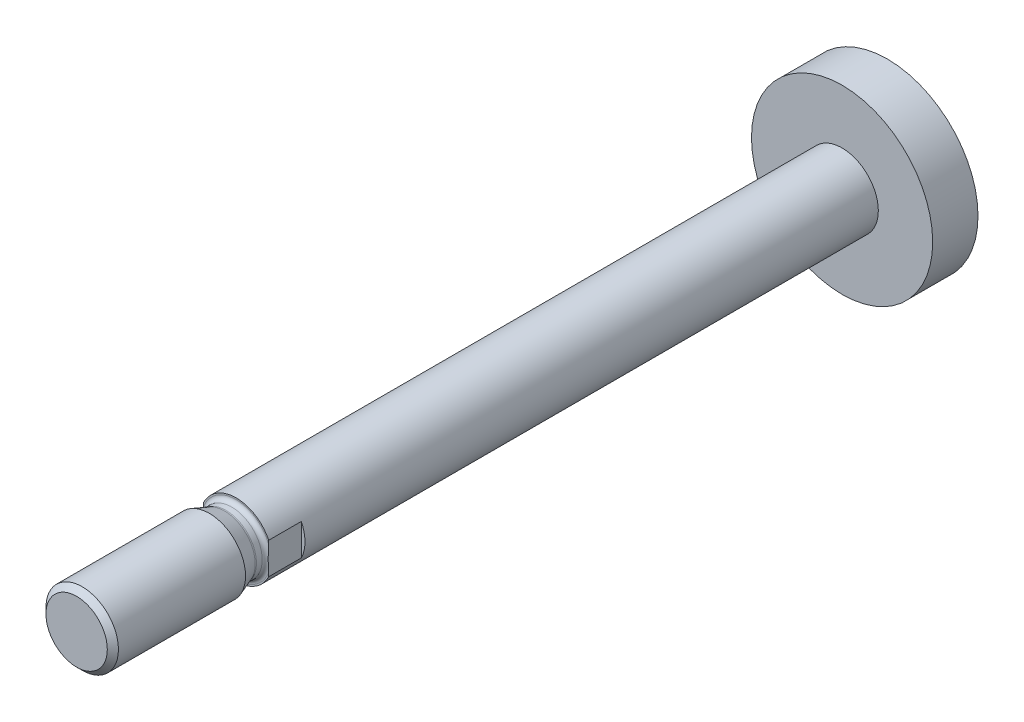
ISO-10303-21;
HEADER;
FILE_DESCRIPTION(('STEP AP214'),'2;1');
FILE_NAME('part.step','',(''),(''),'','','');
FILE_SCHEMA(('AUTOMOTIVE_DESIGN { 1 0 10303 214 1 1 1 1 }'));
ENDSEC;
DATA;
#1=APPLICATION_CONTEXT('core data for automotive mechanical design processes');
#2=APPLICATION_PROTOCOL_DEFINITION('international standard','automotive_design',2000,#1);
#3=PRODUCT_CONTEXT('',#1,'mechanical');
#4=PRODUCT('Part','Part','',(#3));
#5=PRODUCT_RELATED_PRODUCT_CATEGORY('part','',(#4));
#6=PRODUCT_DEFINITION_FORMATION('','',#4);
#7=PRODUCT_DEFINITION_CONTEXT('part definition',#1,'design');
#8=PRODUCT_DEFINITION('design','',#6,#7);
#9=PRODUCT_DEFINITION_SHAPE('','',#8);
#10=(LENGTH_UNIT() NAMED_UNIT(*) SI_UNIT(.MILLI.,.METRE.));
#11=(NAMED_UNIT(*) PLANE_ANGLE_UNIT() SI_UNIT($,.RADIAN.));
#12=(NAMED_UNIT(*) SI_UNIT($,.STERADIAN.) SOLID_ANGLE_UNIT());
#13=UNCERTAINTY_MEASURE_WITH_UNIT(LENGTH_MEASURE(1.E-05),#10,'distance_accuracy_value','');
#14=(GEOMETRIC_REPRESENTATION_CONTEXT(3) GLOBAL_UNCERTAINTY_ASSIGNED_CONTEXT((#13)) GLOBAL_UNIT_ASSIGNED_CONTEXT((#10,
#11,#12)) REPRESENTATION_CONTEXT('',''));
#15=CARTESIAN_POINT('',(0.,0.,0.));
#16=DIRECTION('',(0.,0.,1.));
#17=DIRECTION('',(1.,0.,0.));
#18=AXIS2_PLACEMENT_3D('',#15,#16,#17);
#19=CARTESIAN_POINT('',(0.,0.,1.5));
#20=DIRECTION('',(0.,0.,1.));
#21=DIRECTION('',(-1.,0.,0.));
#22=AXIS2_PLACEMENT_3D('',#19,#20,#21);
#23=PLANE('',#22);
#24=CARTESIAN_POINT('',(0.,0.,1.5));
#25=DIRECTION('',(0.,0.,1.));
#26=DIRECTION('',(-1.,0.,0.));
#27=AXIS2_PLACEMENT_3D('',#24,#25,#26);
#28=CIRCLE('',#27,5.);
#29=CARTESIAN_POINT('',(-4.5,2.17944947177034,1.5));
#30=VERTEX_POINT('',#29);
#31=CARTESIAN_POINT('',(-4.5,-2.17944947177034,1.5));
#32=VERTEX_POINT('',#31);
#33=EDGE_CURVE('E11',#30,#32,#28,.T.);
#34=ORIENTED_EDGE('',*,*,#33,.T.);
#35=DIRECTION('',(0.,1.,0.));
#36=VECTOR('',#35,1.);
#37=CARTESIAN_POINT('',(-4.5,-9.,1.5));
#38=LINE('',#37,#36);
#39=EDGE_CURVE('E143',#32,#30,#38,.T.);
#40=ORIENTED_EDGE('',*,*,#39,.T.);
#41=EDGE_LOOP('',(#34,#40));
#42=FACE_BOUND('',#41,.T.);
#43=ADVANCED_FACE('F16',(#42),#23,.T.);
#44=CARTESIAN_POINT('',(0.,0.,-83.85));
#45=DIRECTION('',(0.,0.,1.));
#46=DIRECTION('',(1.,0.,0.));
#47=AXIS2_PLACEMENT_3D('',#44,#45,#46);
#48=CYLINDRICAL_SURFACE('',#47,5.);
#49=CARTESIAN_POINT('',(0.,0.,-77.6));
#50=DIRECTION('',(0.,0.,-1.));
#51=DIRECTION('',(1.,0.,0.));
#52=AXIS2_PLACEMENT_3D('',#49,#50,#51);
#53=CIRCLE('',#52,5.);
#54=CARTESIAN_POINT('',(5.,0.,-77.6));
#55=VERTEX_POINT('',#54);
#56=EDGE_CURVE('E28',#55,#55,#53,.T.);
#57=ORIENTED_EDGE('',*,*,#56,.F.);
#58=EDGE_LOOP('',(#57));
#59=FACE_BOUND('',#58,.T.);
#60=DIRECTION('',(0.,0.,-1.));
#61=VECTOR('',#60,1.);
#62=CARTESIAN_POINT('',(4.5,-2.17944947177034,-83.85));
#63=LINE('',#62,#61);
#64=CARTESIAN_POINT('',(4.5,-2.17944947177034,6.));
#65=VERTEX_POINT('',#64);
#66=CARTESIAN_POINT('',(4.5,-2.17944947177034,1.5));
#67=VERTEX_POINT('',#66);
#68=EDGE_CURVE('E229',#65,#67,#63,.T.);
#69=ORIENTED_EDGE('',*,*,#68,.F.);
#70=CARTESIAN_POINT('',(0.,0.,6.));
#71=DIRECTION('',(0.,0.,-1.));
#72=DIRECTION('',(1.,0.,0.));
#73=AXIS2_PLACEMENT_3D('',#70,#71,#72);
#74=CIRCLE('',#73,5.);
#75=CARTESIAN_POINT('',(-4.5,-2.17944947177034,6.));
#76=VERTEX_POINT('',#75);
#77=EDGE_CURVE('E264',#65,#76,#74,.T.);
#78=ORIENTED_EDGE('',*,*,#77,.T.);
#79=DIRECTION('',(0.,0.,1.));
#80=VECTOR('',#79,1.);
#81=CARTESIAN_POINT('',(-4.5,-2.17944947177034,-83.85));
#82=LINE('',#81,#80);
#83=EDGE_CURVE('E224',#32,#76,#82,.T.);
#84=ORIENTED_EDGE('',*,*,#83,.F.);
#85=ORIENTED_EDGE('',*,*,#33,.F.);
#86=DIRECTION('',(0.,0.,-1.));
#87=VECTOR('',#86,1.);
#88=CARTESIAN_POINT('',(-4.5,2.17944947177034,-83.85));
#89=LINE('',#88,#87);
#90=CARTESIAN_POINT('',(-4.5,2.17944947177034,6.));
#91=VERTEX_POINT('',#90);
#92=EDGE_CURVE('E139',#91,#30,#89,.T.);
#93=ORIENTED_EDGE('',*,*,#92,.F.);
#94=CARTESIAN_POINT('',(0.,0.,6.));
#95=DIRECTION('',(0.,0.,-1.));
#96=DIRECTION('',(1.,0.,0.));
#97=AXIS2_PLACEMENT_3D('',#94,#95,#96);
#98=CIRCLE('',#97,5.);
#99=CARTESIAN_POINT('',(4.5,2.17944947177034,6.));
#100=VERTEX_POINT('',#99);
#101=EDGE_CURVE('E274',#91,#100,#98,.T.);
#102=ORIENTED_EDGE('',*,*,#101,.T.);
#103=DIRECTION('',(0.,0.,1.));
#104=VECTOR('',#103,1.);
#105=CARTESIAN_POINT('',(4.5,2.17944947177034,-83.85));
#106=LINE('',#105,#104);
#107=CARTESIAN_POINT('',(4.5,2.17944947177034,1.5));
#108=VERTEX_POINT('',#107);
#109=EDGE_CURVE('E270',#108,#100,#106,.T.);
#110=ORIENTED_EDGE('',*,*,#109,.F.);
#111=CARTESIAN_POINT('',(0.,0.,1.5));
#112=DIRECTION('',(0.,0.,1.));
#113=DIRECTION('',(-1.,0.,0.));
#114=AXIS2_PLACEMENT_3D('',#111,#112,#113);
#115=CIRCLE('',#114,5.);
#116=EDGE_CURVE('E257',#67,#108,#115,.T.);
#117=ORIENTED_EDGE('',*,*,#116,.F.);
#118=EDGE_LOOP('',(#69,#78,#84,#85,#93,#102,#110,#117));
#119=FACE_BOUND('',#118,.T.);
#120=ADVANCED_FACE('F178',(#59,#119),#48,.T.);
#121=CARTESIAN_POINT('',(0.,-5.,-77.6));
#122=DIRECTION('',(0.,0.,-1.));
#123=DIRECTION('',(0.,1.,0.));
#124=AXIS2_PLACEMENT_3D('',#121,#122,#123);
#125=PLANE('',#124);
#126=ORIENTED_EDGE('',*,*,#56,.T.);
#127=EDGE_LOOP('',(#126));
#128=FACE_BOUND('',#127,.T.);
#129=CARTESIAN_POINT('',(0.,0.,-77.6));
#130=DIRECTION('',(0.,0.,-1.));
#131=DIRECTION('',(1.,0.,0.));
#132=AXIS2_PLACEMENT_3D('',#129,#130,#131);
#133=CIRCLE('',#132,12.5);
#134=CARTESIAN_POINT('',(12.5,0.,-77.6));
#135=VERTEX_POINT('',#134);
#136=EDGE_CURVE('E132',#135,#135,#133,.T.);
#137=ORIENTED_EDGE('',*,*,#136,.F.);
#138=EDGE_LOOP('',(#137));
#139=FACE_BOUND('',#138,.T.);
#140=ADVANCED_FACE('F175',(#128,#139),#125,.F.);
#141=CARTESIAN_POINT('',(0.,0.,-83.85));
#142=DIRECTION('',(0.,0.,1.));
#143=DIRECTION('',(1.,0.,0.));
#144=AXIS2_PLACEMENT_3D('',#141,#142,#143);
#145=CYLINDRICAL_SURFACE('',#144,12.5);
#146=CARTESIAN_POINT('',(0.,0.,-83.85));
#147=DIRECTION('',(0.,0.,-1.));
#148=DIRECTION('',(1.,0.,0.));
#149=AXIS2_PLACEMENT_3D('',#146,#147,#148);
#150=CIRCLE('',#149,12.5);
#151=CARTESIAN_POINT('',(12.5,0.,-83.85));
#152=VERTEX_POINT('',#151);
#153=EDGE_CURVE('E126',#152,#152,#150,.T.);
#154=ORIENTED_EDGE('',*,*,#153,.F.);
#155=EDGE_LOOP('',(#154));
#156=FACE_BOUND('',#155,.T.);
#157=ORIENTED_EDGE('',*,*,#136,.T.);
#158=EDGE_LOOP('',(#157));
#159=FACE_BOUND('',#158,.T.);
#160=ADVANCED_FACE('F173',(#156,#159),#145,.T.);
#161=CARTESIAN_POINT('',(0.,-12.5,-83.85));
#162=DIRECTION('',(0.,0.,1.));
#163=DIRECTION('',(-1.,0.,0.));
#164=AXIS2_PLACEMENT_3D('',#161,#162,#163);
#165=PLANE('',#164);
#166=ORIENTED_EDGE('',*,*,#153,.T.);
#167=EDGE_LOOP('',(#166));
#168=FACE_BOUND('',#167,.T.);
#169=ADVANCED_FACE('F169',(#168),#165,.F.);
#170=CARTESIAN_POINT('',(0.,0.,28.));
#171=DIRECTION('',(0.,0.,-1.));
#172=DIRECTION('',(0.,1.,0.));
#173=AXIS2_PLACEMENT_3D('',#170,#171,#172);
#174=PLANE('',#173);
#175=CARTESIAN_POINT('',(0.,0.,28.));
#176=DIRECTION('',(0.,0.,-1.));
#177=DIRECTION('',(1.,0.,0.));
#178=AXIS2_PLACEMENT_3D('',#175,#176,#177);
#179=CIRCLE('',#178,4.233);
#180=CARTESIAN_POINT('',(4.233,0.,28.));
#181=VERTEX_POINT('',#180);
#182=EDGE_CURVE('E121',#181,#181,#179,.T.);
#183=ORIENTED_EDGE('',*,*,#182,.F.);
#184=EDGE_LOOP('',(#183));
#185=FACE_BOUND('',#184,.T.);
#186=ADVANCED_FACE('F172',(#185),#174,.F.);
#187=CARTESIAN_POINT('',(0.,0.,28.));
#188=DIRECTION('',(0.,0.,-1.));
#189=DIRECTION('',(1.,0.,0.));
#190=AXIS2_PLACEMENT_3D('',#187,#188,#189);
#191=CONICAL_SURFACE('',#190,4.233,0.785398163397448);
#192=ORIENTED_EDGE('',*,*,#182,.T.);
#193=EDGE_LOOP('',(#192));
#194=FACE_BOUND('',#193,.T.);
#195=CARTESIAN_POINT('',(0.,0.,27.233));
#196=DIRECTION('',(0.,0.,-1.));
#197=DIRECTION('',(1.,0.,0.));
#198=AXIS2_PLACEMENT_3D('',#195,#196,#197);
#199=CIRCLE('',#198,5.);
#200=CARTESIAN_POINT('',(5.,0.,27.233));
#201=VERTEX_POINT('',#200);
#202=EDGE_CURVE('E127',#201,#201,#199,.T.);
#203=ORIENTED_EDGE('',*,*,#202,.F.);
#204=EDGE_LOOP('',(#203));
#205=FACE_BOUND('',#204,.T.);
#206=ADVANCED_FACE('F122',(#194,#205),#191,.T.);
#207=CARTESIAN_POINT('',(0.,0.,5.));
#208=DIRECTION('',(0.,0.,1.));
#209=DIRECTION('',(1.,0.,0.));
#210=AXIS2_PLACEMENT_3D('',#207,#208,#209);
#211=CYLINDRICAL_SURFACE('',#210,5.);
#212=CARTESIAN_POINT('',(0.,0.,9.69798193556369));
#213=DIRECTION('',(0.,0.,-1.));
#214=DIRECTION('',(1.,0.,0.));
#215=AXIS2_PLACEMENT_3D('',#212,#213,#214);
#216=CIRCLE('',#215,5.);
#217=CARTESIAN_POINT('',(5.,0.,9.69798193556369));
#218=VERTEX_POINT('',#217);
#219=EDGE_CURVE('E114',#218,#218,#216,.T.);
#220=ORIENTED_EDGE('',*,*,#219,.F.);
#221=EDGE_LOOP('',(#220));
#222=FACE_BOUND('',#221,.T.);
#223=ORIENTED_EDGE('',*,*,#202,.T.);
#224=EDGE_LOOP('',(#223));
#225=FACE_BOUND('',#224,.T.);
#226=ADVANCED_FACE('F188',(#222,#225),#211,.T.);
#227=CARTESIAN_POINT('',(0.,0.,9.69798193556369));
#228=DIRECTION('',(0.,0.,1.));
#229=DIRECTION('',(-1.,0.,0.));
#230=AXIS2_PLACEMENT_3D('',#227,#228,#229);
#231=CONICAL_SURFACE('',#230,5.,0.349065850398867);
#232=CARTESIAN_POINT('',(0.,0.,7.59941589757032));
#233=DIRECTION('',(0.,0.,-1.));
#234=DIRECTION('',(1.,0.,0.));
#235=AXIS2_PLACEMENT_3D('',#232,#233,#234);
#236=CIRCLE('',#235,4.23618442752846);
#237=CARTESIAN_POINT('',(4.23618442752846,0.,7.59941589757032));
#238=VERTEX_POINT('',#237);
#239=EDGE_CURVE('E105',#238,#238,#236,.T.);
#240=ORIENTED_EDGE('',*,*,#239,.F.);
#241=EDGE_LOOP('',(#240));
#242=FACE_BOUND('',#241,.T.);
#243=ORIENTED_EDGE('',*,*,#219,.T.);
#244=EDGE_LOOP('',(#243));
#245=FACE_BOUND('',#244,.T.);
#246=ADVANCED_FACE('F185',(#242,#245),#231,.T.);
#247=CARTESIAN_POINT('',(0.,0.,7.39420381157492));
#248=DIRECTION('',(0.,0.,-1.));
#249=DIRECTION('',(1.,0.,0.));
#250=AXIS2_PLACEMENT_3D('',#247,#248,#249);
#251=TOROIDAL_SURFACE('',#250,4.8,0.6);
#252=CARTESIAN_POINT('',(0.,0.,7.39420381157492));
#253=DIRECTION('',(0.,0.,-1.));
#254=DIRECTION('',(1.,0.,0.));
#255=AXIS2_PLACEMENT_3D('',#252,#253,#254);
#256=CIRCLE('',#255,4.2);
#257=CARTESIAN_POINT('',(4.2,0.,7.39420381157492));
#258=VERTEX_POINT('',#257);
#259=EDGE_CURVE('E295',#258,#258,#256,.T.);
#260=ORIENTED_EDGE('',*,*,#259,.F.);
#261=EDGE_LOOP('',(#260));
#262=FACE_BOUND('',#261,.T.);
#263=ORIENTED_EDGE('',*,*,#239,.T.);
#264=EDGE_LOOP('',(#263));
#265=FACE_BOUND('',#264,.T.);
#266=ADVANCED_FACE('F167',(#262,#265),#251,.F.);
#267=CARTESIAN_POINT('',(0.,0.,5.));
#268=DIRECTION('',(0.,0.,1.));
#269=DIRECTION('',(1.,0.,0.));
#270=AXIS2_PLACEMENT_3D('',#267,#268,#269);
#271=CYLINDRICAL_SURFACE('',#270,4.2);
#272=CARTESIAN_POINT('',(0.,0.,6.6));
#273=DIRECTION('',(0.,0.,-1.));
#274=DIRECTION('',(1.,0.,0.));
#275=AXIS2_PLACEMENT_3D('',#272,#273,#274);
#276=CIRCLE('',#275,4.2);
#277=CARTESIAN_POINT('',(4.2,0.,6.6));
#278=VERTEX_POINT('',#277);
#279=EDGE_CURVE('E263',#278,#278,#276,.T.);
#280=ORIENTED_EDGE('',*,*,#279,.F.);
#281=EDGE_LOOP('',(#280));
#282=FACE_BOUND('',#281,.T.);
#283=ORIENTED_EDGE('',*,*,#259,.T.);
#284=EDGE_LOOP('',(#283));
#285=FACE_BOUND('',#284,.T.);
#286=ADVANCED_FACE('F201',(#282,#285),#271,.T.);
#287=CARTESIAN_POINT('',(0.,0.,6.6));
#288=DIRECTION('',(0.,0.,-1.));
#289=DIRECTION('',(1.,0.,0.));
#290=AXIS2_PLACEMENT_3D('',#287,#288,#289);
#291=TOROIDAL_SURFACE('',#290,4.8,0.6);
#292=CARTESIAN_POINT('',(0.,0.,6.));
#293=DIRECTION('',(0.,0.,-1.));
#294=DIRECTION('',(1.,0.,0.));
#295=AXIS2_PLACEMENT_3D('',#292,#293,#294);
#296=CIRCLE('',#295,4.8);
#297=CARTESIAN_POINT('',(4.5,-1.67032930884898,5.99999999999964));
#298=VERTEX_POINT('',#297);
#299=CARTESIAN_POINT('',(-4.5,-1.670329308849,6.));
#300=VERTEX_POINT('',#299);
#301=EDGE_CURVE('E260',#298,#300,#296,.T.);
#302=ORIENTED_EDGE('',*,*,#301,.F.);
#303=CARTESIAN_POINT('',(4.5,1.670329308849,6.));
#304=CARTESIAN_POINT('',(4.5,1.48763241012404,6.));
#305=CARTESIAN_POINT('',(4.5,1.25130446973823,6.01396849111585));
#306=CARTESIAN_POINT('',(4.5,1.15555015870283,6.01962818264796));
#307=CARTESIAN_POINT('',(4.5,0.832499035834669,6.043237610389));
#308=CARTESIAN_POINT('',(4.5,0.321450484231781,6.0805863858525));
#309=CARTESIAN_POINT('',(4.5,-0.00547900461721033,6.08038283199304));
#310=CARTESIAN_POINT('',(4.5,-0.327448691189561,6.08018236622116));
#311=CARTESIAN_POINT('',(4.5,-0.83870582700158,6.04278377593771));
#312=CARTESIAN_POINT('',(4.5,-1.15402548832964,6.01971806204094));
#313=CARTESIAN_POINT('',(4.5,-1.25481617858578,6.01378267925269));
#314=CARTESIAN_POINT('',(4.5,-1.4888643950221,6.));
#315=CARTESIAN_POINT('',(4.5,-1.67032930884896,6.));
#316=B_SPLINE_CURVE_WITH_KNOTS('',2,(#303,#304,#305,#306,#307,#308,#309,#310,#311,#312,#313,
#314,#315),.UNSPECIFIED.,.F.,.F.,(3,2,2,2,2,2,3),(0.,0.125,0.25,0.5,0.75,0.875,1.),.UNSPECIFIED.);
#317=CARTESIAN_POINT('',(4.5,1.670329308849,6.));
#318=VERTEX_POINT('',#317);
#319=EDGE_CURVE('E150',#318,#298,#316,.T.);
#320=ORIENTED_EDGE('',*,*,#319,.F.);
#321=CARTESIAN_POINT('',(0.,0.,6.));
#322=DIRECTION('',(0.,0.,-1.));
#323=DIRECTION('',(1.,0.,0.));
#324=AXIS2_PLACEMENT_3D('',#321,#322,#323);
#325=CIRCLE('',#324,4.8);
#326=CARTESIAN_POINT('',(-4.5,1.67032930884898,5.99999999999964));
#327=VERTEX_POINT('',#326);
#328=EDGE_CURVE('E272',#327,#318,#325,.T.);
#329=ORIENTED_EDGE('',*,*,#328,.F.);
#330=CARTESIAN_POINT('',(-4.5,-1.670329308849,6.));
#331=CARTESIAN_POINT('',(-4.5,-1.48763241012404,6.));
#332=CARTESIAN_POINT('',(-4.5,-1.25130446973823,6.01396849111585));
#333=CARTESIAN_POINT('',(-4.5,-1.15555015870283,6.01962818264796));
#334=CARTESIAN_POINT('',(-4.5,-0.832499035834669,6.043237610389));
#335=CARTESIAN_POINT('',(-4.5,-0.321450484231781,6.0805863858525));
#336=CARTESIAN_POINT('',(-4.5,0.00547900461721033,6.08038283199304));
#337=CARTESIAN_POINT('',(-4.5,0.327448691189561,6.08018236622116));
#338=CARTESIAN_POINT('',(-4.5,0.83870582700158,6.04278377593771));
#339=CARTESIAN_POINT('',(-4.5,1.15402548832964,6.01971806204094));
#340=CARTESIAN_POINT('',(-4.5,1.25481617858578,6.01378267925269));
#341=CARTESIAN_POINT('',(-4.5,1.4888643950221,6.));
#342=CARTESIAN_POINT('',(-4.5,1.67032930884896,6.));
#343=B_SPLINE_CURVE_WITH_KNOTS('',2,(#330,#331,#332,#333,#334,#335,#336,#337,#338,#339,#340,
#341,#342),.UNSPECIFIED.,.F.,.F.,(3,2,2,2,2,2,3),(0.,0.125,0.25,0.5,0.75,0.875,1.),.UNSPECIFIED.);
#344=EDGE_CURVE('E223',#300,#327,#343,.T.);
#345=ORIENTED_EDGE('',*,*,#344,.F.);
#346=EDGE_LOOP('',(#302,#320,#329,#345));
#347=FACE_BOUND('',#346,.T.);
#348=ORIENTED_EDGE('',*,*,#279,.T.);
#349=EDGE_LOOP('',(#348));
#350=FACE_BOUND('',#349,.T.);
#351=ADVANCED_FACE('F197',(#347,#350),#291,.F.);
#352=CARTESIAN_POINT('',(0.,0.,6.));
#353=DIRECTION('',(0.,0.,-1.));
#354=DIRECTION('',(0.,1.,0.));
#355=AXIS2_PLACEMENT_3D('',#352,#353,#354);
#356=PLANE('',#355);
#357=DIRECTION('',(0.,1.,0.));
#358=VECTOR('',#357,1.);
#359=CARTESIAN_POINT('',(-4.5,0.,6.));
#360=LINE('',#359,#358);
#361=EDGE_CURVE('E214',#76,#300,#360,.T.);
#362=ORIENTED_EDGE('',*,*,#361,.F.);
#363=ORIENTED_EDGE('',*,*,#77,.F.);
#364=DIRECTION('',(0.,-1.,0.));
#365=VECTOR('',#364,1.);
#366=CARTESIAN_POINT('',(4.5,0.,6.));
#367=LINE('',#366,#365);
#368=EDGE_CURVE('E254',#298,#65,#367,.T.);
#369=ORIENTED_EDGE('',*,*,#368,.F.);
#370=ORIENTED_EDGE('',*,*,#301,.T.);
#371=EDGE_LOOP('',(#362,#363,#369,#370));
#372=FACE_BOUND('',#371,.T.);
#373=ADVANCED_FACE('F200',(#372),#356,.F.);
#374=CARTESIAN_POINT('',(0.,0.,6.));
#375=DIRECTION('',(0.,0.,-1.));
#376=DIRECTION('',(0.,1.,0.));
#377=AXIS2_PLACEMENT_3D('',#374,#375,#376);
#378=PLANE('',#377);
#379=DIRECTION('',(0.,-1.,0.));
#380=VECTOR('',#379,1.);
#381=CARTESIAN_POINT('',(4.5,0.,6.));
#382=LINE('',#381,#380);
#383=EDGE_CURVE('E267',#100,#318,#382,.T.);
#384=ORIENTED_EDGE('',*,*,#383,.F.);
#385=ORIENTED_EDGE('',*,*,#101,.F.);
#386=DIRECTION('',(0.,1.,0.));
#387=VECTOR('',#386,1.);
#388=CARTESIAN_POINT('',(-4.5,0.,6.));
#389=LINE('',#388,#387);
#390=EDGE_CURVE('E226',#327,#91,#389,.T.);
#391=ORIENTED_EDGE('',*,*,#390,.F.);
#392=ORIENTED_EDGE('',*,*,#328,.T.);
#393=EDGE_LOOP('',(#384,#385,#391,#392));
#394=FACE_BOUND('',#393,.T.);
#395=ADVANCED_FACE('F195',(#394),#378,.F.);
#396=CARTESIAN_POINT('',(0.,0.,1.5));
#397=DIRECTION('',(0.,0.,1.));
#398=DIRECTION('',(-1.,0.,0.));
#399=AXIS2_PLACEMENT_3D('',#396,#397,#398);
#400=PLANE('',#399);
#401=ORIENTED_EDGE('',*,*,#116,.T.);
#402=DIRECTION('',(0.,-1.,0.));
#403=VECTOR('',#402,1.);
#404=CARTESIAN_POINT('',(4.5,9.,1.5));
#405=LINE('',#404,#403);
#406=EDGE_CURVE('E237',#108,#67,#405,.T.);
#407=ORIENTED_EDGE('',*,*,#406,.T.);
#408=EDGE_LOOP('',(#401,#407));
#409=FACE_BOUND('',#408,.T.);
#410=ADVANCED_FACE('F166',(#409),#400,.T.);
#411=CARTESIAN_POINT('',(4.5,9.,7.));
#412=DIRECTION('',(1.,0.,0.));
#413=DIRECTION('',(0.,0.,1.));
#414=AXIS2_PLACEMENT_3D('',#411,#412,#413);
#415=PLANE('',#414);
#416=ORIENTED_EDGE('',*,*,#68,.T.);
#417=ORIENTED_EDGE('',*,*,#406,.F.);
#418=ORIENTED_EDGE('',*,*,#109,.T.);
#419=ORIENTED_EDGE('',*,*,#383,.T.);
#420=ORIENTED_EDGE('',*,*,#319,.T.);
#421=ORIENTED_EDGE('',*,*,#368,.T.);
#422=EDGE_LOOP('',(#416,#417,#418,#419,#420,#421));
#423=FACE_BOUND('',#422,.T.);
#424=ADVANCED_FACE('F156',(#423),#415,.T.);
#425=CARTESIAN_POINT('',(-4.5,-9.,7.));
#426=DIRECTION('',(-1.,0.,0.));
#427=DIRECTION('',(0.,-1.,0.));
#428=AXIS2_PLACEMENT_3D('',#425,#426,#427);
#429=PLANE('',#428);
#430=ORIENTED_EDGE('',*,*,#92,.T.);
#431=ORIENTED_EDGE('',*,*,#39,.F.);
#432=ORIENTED_EDGE('',*,*,#83,.T.);
#433=ORIENTED_EDGE('',*,*,#361,.T.);
#434=ORIENTED_EDGE('',*,*,#344,.T.);
#435=ORIENTED_EDGE('',*,*,#390,.T.);
#436=EDGE_LOOP('',(#430,#431,#432,#433,#434,#435));
#437=FACE_BOUND('',#436,.T.);
#438=ADVANCED_FACE('F18',(#437),#429,.T.);
#439=CLOSED_SHELL('',(#43,#120,#140,#160,#169,#186,#206,#226,#246,#266,#286,#351,#373,#395,#410,
#424,#438));
#440=MANIFOLD_SOLID_BREP('B1',#439);
#441=ADVANCED_BREP_SHAPE_REPRESENTATION('',(#18,#440),#14);
#442=SHAPE_DEFINITION_REPRESENTATION(#9,#441);
ENDSEC;
END-ISO-10303-21;
